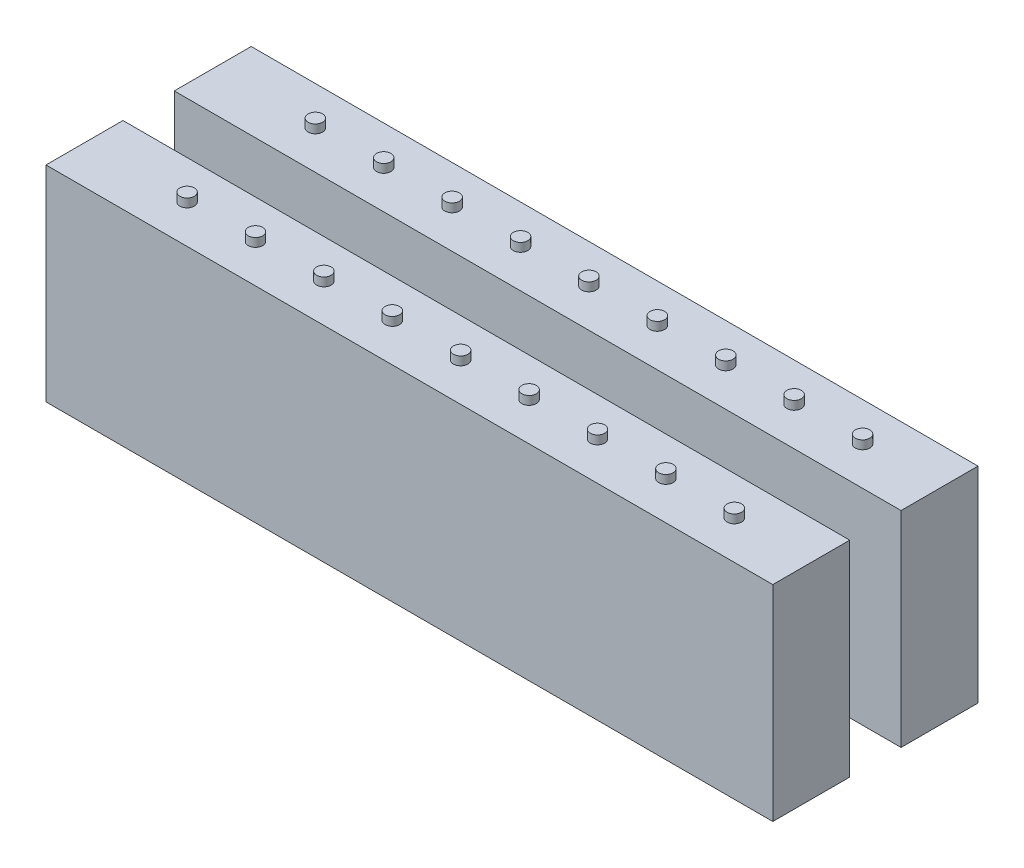
ISO-10303-21;
HEADER;
FILE_DESCRIPTION(('STEP AP214'),'2;1');
FILE_NAME('part.step','',(''),(''),'','','');
FILE_SCHEMA(('AUTOMOTIVE_DESIGN { 1 0 10303 214 1 1 1 1 }'));
ENDSEC;
DATA;
#1=APPLICATION_CONTEXT('core data for automotive mechanical design processes');
#2=APPLICATION_PROTOCOL_DEFINITION('international standard','automotive_design',2000,#1);
#3=PRODUCT_CONTEXT('',#1,'mechanical');
#4=PRODUCT('Part','Part','',(#3));
#5=PRODUCT_RELATED_PRODUCT_CATEGORY('part','',(#4));
#6=PRODUCT_DEFINITION_FORMATION('','',#4);
#7=PRODUCT_DEFINITION_CONTEXT('part definition',#1,'design');
#8=PRODUCT_DEFINITION('design','',#6,#7);
#9=PRODUCT_DEFINITION_SHAPE('','',#8);
#10=(LENGTH_UNIT() NAMED_UNIT(*) SI_UNIT(.MILLI.,.METRE.));
#11=(NAMED_UNIT(*) PLANE_ANGLE_UNIT() SI_UNIT($,.RADIAN.));
#12=(NAMED_UNIT(*) SI_UNIT($,.STERADIAN.) SOLID_ANGLE_UNIT());
#13=UNCERTAINTY_MEASURE_WITH_UNIT(LENGTH_MEASURE(1.E-05),#10,'distance_accuracy_value','');
#14=(GEOMETRIC_REPRESENTATION_CONTEXT(3) GLOBAL_UNCERTAINTY_ASSIGNED_CONTEXT((#13)) GLOBAL_UNIT_ASSIGNED_CONTEXT((#10,
#11,#12)) REPRESENTATION_CONTEXT('',''));
#15=CARTESIAN_POINT('',(0.,0.,0.));
#16=DIRECTION('',(0.,0.,1.));
#17=DIRECTION('',(1.,0.,0.));
#18=AXIS2_PLACEMENT_3D('',#15,#16,#17);
#19=CARTESIAN_POINT('',(-43.0162312083669,168.156845873752,207.38560548584));
#20=DIRECTION('',(1.,0.,0.));
#21=DIRECTION('',(0.,0.,-1.));
#22=AXIS2_PLACEMENT_3D('',#19,#20,#21);
#23=PLANE('',#22);
#24=DIRECTION('',(0.,0.,1.));
#25=VECTOR('',#24,1.);
#26=CARTESIAN_POINT('',(-43.0162312083669,165.616845873752,184.52560548584));
#27=LINE('',#26,#25);
#28=CARTESIAN_POINT('',(-43.0162312083669,165.616845873752,184.52560548584));
#29=VERTEX_POINT('',#28);
#30=CARTESIAN_POINT('',(-43.0162312083669,165.616845873752,207.38560548584));
#31=VERTEX_POINT('',#30);
#32=EDGE_CURVE('E89',#29,#31,#27,.T.);
#33=ORIENTED_EDGE('',*,*,#32,.F.);
#34=DIRECTION('',(0.,-1.,0.));
#35=VECTOR('',#34,1.);
#36=CARTESIAN_POINT('',(-43.0162312083669,168.156845873752,184.52560548584));
#37=LINE('',#36,#35);
#38=CARTESIAN_POINT('',(-43.0162312083669,104.656845873752,184.52560548584));
#39=VERTEX_POINT('',#38);
#40=EDGE_CURVE('E73',#29,#39,#37,.T.);
#41=ORIENTED_EDGE('',*,*,#40,.T.);
#42=DIRECTION('',(0.,0.,1.));
#43=VECTOR('',#42,1.);
#44=CARTESIAN_POINT('',(-43.0162312083669,104.656845873752,207.38560548584));
#45=LINE('',#44,#43);
#46=CARTESIAN_POINT('',(-43.0162312083669,104.656845873752,207.38560548584));
#47=VERTEX_POINT('',#46);
#48=EDGE_CURVE('E104',#39,#47,#45,.T.);
#49=ORIENTED_EDGE('',*,*,#48,.T.);
#50=DIRECTION('',(0.,-1.,0.));
#51=VECTOR('',#50,1.);
#52=CARTESIAN_POINT('',(-43.0162312083669,168.156845873752,207.38560548584));
#53=LINE('',#52,#51);
#54=EDGE_CURVE('E13',#31,#47,#53,.T.);
#55=ORIENTED_EDGE('',*,*,#54,.F.);
#56=EDGE_LOOP('',(#33,#41,#49,#55));
#57=FACE_BOUND('',#56,.T.);
#58=ADVANCED_FACE('F51',(#57),#23,.F.);
#59=CARTESIAN_POINT('',(-43.0162312083669,168.156845873752,207.38560548584));
#60=DIRECTION('',(0.,0.,-1.));
#61=DIRECTION('',(-1.,0.,0.));
#62=AXIS2_PLACEMENT_3D('',#59,#60,#61);
#63=PLANE('',#62);
#64=DIRECTION('',(1.,0.,0.));
#65=VECTOR('',#64,1.);
#66=CARTESIAN_POINT('',(-43.0162312083669,165.616845873752,207.38560548584));
#67=LINE('',#66,#65);
#68=CARTESIAN_POINT('',(172.883768791633,165.616845873752,207.38560548584));
#69=VERTEX_POINT('',#68);
#70=EDGE_CURVE('E92',#31,#69,#67,.T.);
#71=ORIENTED_EDGE('',*,*,#70,.F.);
#72=ORIENTED_EDGE('',*,*,#54,.T.);
#73=DIRECTION('',(1.,0.,0.));
#74=VECTOR('',#73,1.);
#75=CARTESIAN_POINT('',(-43.0162312083669,104.656845873752,207.38560548584));
#76=LINE('',#75,#74);
#77=CARTESIAN_POINT('',(172.883768791633,104.656845873752,207.38560548584));
#78=VERTEX_POINT('',#77);
#79=EDGE_CURVE('E107',#47,#78,#76,.T.);
#80=ORIENTED_EDGE('',*,*,#79,.T.);
#81=DIRECTION('',(0.,-1.,0.));
#82=VECTOR('',#81,1.);
#83=CARTESIAN_POINT('',(172.883768791633,168.156845873752,207.38560548584));
#84=LINE('',#83,#82);
#85=EDGE_CURVE('E58',#69,#78,#84,.T.);
#86=ORIENTED_EDGE('',*,*,#85,.F.);
#87=EDGE_LOOP('',(#71,#72,#80,#86));
#88=FACE_BOUND('',#87,.T.);
#89=ADVANCED_FACE('F99',(#88),#63,.F.);
#90=CARTESIAN_POINT('',(172.883768791633,168.156845873752,207.38560548584));
#91=DIRECTION('',(-1.,0.,0.));
#92=DIRECTION('',(0.,0.,1.));
#93=AXIS2_PLACEMENT_3D('',#90,#91,#92);
#94=PLANE('',#93);
#95=DIRECTION('',(0.,0.,-1.));
#96=VECTOR('',#95,1.);
#97=CARTESIAN_POINT('',(172.883768791633,165.616845873752,184.52560548584));
#98=LINE('',#97,#96);
#99=CARTESIAN_POINT('',(172.883768791633,165.616845873752,184.52560548584));
#100=VERTEX_POINT('',#99);
#101=EDGE_CURVE('E65',#69,#100,#98,.T.);
#102=ORIENTED_EDGE('',*,*,#101,.F.);
#103=ORIENTED_EDGE('',*,*,#85,.T.);
#104=DIRECTION('',(0.,0.,-1.));
#105=VECTOR('',#104,1.);
#106=CARTESIAN_POINT('',(172.883768791633,104.656845873752,207.38560548584));
#107=LINE('',#106,#105);
#108=CARTESIAN_POINT('',(172.883768791633,104.656845873752,184.52560548584));
#109=VERTEX_POINT('',#108);
#110=EDGE_CURVE('E109',#78,#109,#107,.T.);
#111=ORIENTED_EDGE('',*,*,#110,.T.);
#112=DIRECTION('',(0.,-1.,0.));
#113=VECTOR('',#112,1.);
#114=CARTESIAN_POINT('',(172.883768791633,168.156845873752,184.52560548584));
#115=LINE('',#114,#113);
#116=EDGE_CURVE('E127',#100,#109,#115,.T.);
#117=ORIENTED_EDGE('',*,*,#116,.F.);
#118=EDGE_LOOP('',(#102,#103,#111,#117));
#119=FACE_BOUND('',#118,.T.);
#120=ADVANCED_FACE('F129',(#119),#94,.F.);
#121=CARTESIAN_POINT('',(-43.0162312083669,168.156845873752,184.52560548584));
#122=DIRECTION('',(0.,0.,1.));
#123=DIRECTION('',(1.,0.,0.));
#124=AXIS2_PLACEMENT_3D('',#121,#122,#123);
#125=PLANE('',#124);
#126=DIRECTION('',(-1.,0.,0.));
#127=VECTOR('',#126,1.);
#128=CARTESIAN_POINT('',(-43.0162312083669,165.616845873752,184.52560548584));
#129=LINE('',#128,#127);
#130=EDGE_CURVE('E93',#100,#29,#129,.T.);
#131=ORIENTED_EDGE('',*,*,#130,.F.);
#132=ORIENTED_EDGE('',*,*,#116,.T.);
#133=DIRECTION('',(-1.,0.,0.));
#134=VECTOR('',#133,1.);
#135=CARTESIAN_POINT('',(-43.0162312083669,104.656845873752,184.52560548584));
#136=LINE('',#135,#134);
#137=EDGE_CURVE('E123',#109,#39,#136,.T.);
#138=ORIENTED_EDGE('',*,*,#137,.T.);
#139=ORIENTED_EDGE('',*,*,#40,.F.);
#140=EDGE_LOOP('',(#131,#132,#138,#139));
#141=FACE_BOUND('',#140,.T.);
#142=ADVANCED_FACE('F134',(#141),#125,.F.);
#143=CARTESIAN_POINT('',(-43.0162312083669,104.656845873752,207.38560548584));
#144=DIRECTION('',(0.,-1.,0.));
#145=DIRECTION('',(0.,0.,-1.));
#146=AXIS2_PLACEMENT_3D('',#143,#144,#145);
#147=PLANE('',#146);
#148=ORIENTED_EDGE('',*,*,#48,.F.);
#149=ORIENTED_EDGE('',*,*,#137,.F.);
#150=ORIENTED_EDGE('',*,*,#110,.F.);
#151=ORIENTED_EDGE('',*,*,#79,.F.);
#152=EDGE_LOOP('',(#148,#149,#150,#151));
#153=FACE_BOUND('',#152,.T.);
#154=ADVANCED_FACE('F132',(#153),#147,.T.);
#155=CARTESIAN_POINT('',(0.,165.616845873752,0.));
#156=DIRECTION('',(0.,1.,0.));
#157=DIRECTION('',(0.,0.,1.));
#158=AXIS2_PLACEMENT_3D('',#155,#156,#157);
#159=PLANE('',#158);
#160=CARTESIAN_POINT('',(150.023768791633,165.616845873752,195.95560548584));
#161=DIRECTION('',(0.,1.,0.));
#162=DIRECTION('',(0.,0.,1.));
#163=AXIS2_PLACEMENT_3D('',#160,#161,#162);
#164=CIRCLE('',#163,2.14999999999999);
#165=CARTESIAN_POINT('',(150.023768791633,165.616845873752,198.10560548584));
#166=VERTEX_POINT('',#165);
#167=EDGE_CURVE('E295',#166,#166,#164,.T.);
#168=ORIENTED_EDGE('',*,*,#167,.F.);
#169=EDGE_LOOP('',(#168));
#170=FACE_BOUND('',#169,.T.);
#171=CARTESIAN_POINT('',(129.703768791633,165.616845873752,195.95560548584));
#172=DIRECTION('',(0.,1.,0.));
#173=DIRECTION('',(0.,0.,1.));
#174=AXIS2_PLACEMENT_3D('',#171,#172,#173);
#175=CIRCLE('',#174,2.14999999999999);
#176=CARTESIAN_POINT('',(129.703768791633,165.616845873752,198.10560548584));
#177=VERTEX_POINT('',#176);
#178=EDGE_CURVE('E302',#177,#177,#175,.T.);
#179=ORIENTED_EDGE('',*,*,#178,.F.);
#180=EDGE_LOOP('',(#179));
#181=FACE_BOUND('',#180,.T.);
#182=CARTESIAN_POINT('',(109.383768791633,165.616845873752,195.95560548584));
#183=DIRECTION('',(0.,1.,0.));
#184=DIRECTION('',(0.,0.,1.));
#185=AXIS2_PLACEMENT_3D('',#182,#183,#184);
#186=CIRCLE('',#185,2.15000000000002);
#187=CARTESIAN_POINT('',(109.383768791633,165.616845873752,198.10560548584));
#188=VERTEX_POINT('',#187);
#189=EDGE_CURVE('E308',#188,#188,#186,.T.);
#190=ORIENTED_EDGE('',*,*,#189,.F.);
#191=EDGE_LOOP('',(#190));
#192=FACE_BOUND('',#191,.T.);
#193=CARTESIAN_POINT('',(89.0637687916331,165.616845873752,195.95560548584));
#194=DIRECTION('',(0.,1.,0.));
#195=DIRECTION('',(0.,0.,1.));
#196=AXIS2_PLACEMENT_3D('',#193,#194,#195);
#197=CIRCLE('',#196,2.15000000000002);
#198=CARTESIAN_POINT('',(89.0637687916331,165.616845873752,198.10560548584));
#199=VERTEX_POINT('',#198);
#200=EDGE_CURVE('E314',#199,#199,#197,.T.);
#201=ORIENTED_EDGE('',*,*,#200,.F.);
#202=EDGE_LOOP('',(#201));
#203=FACE_BOUND('',#202,.T.);
#204=CARTESIAN_POINT('',(68.7437687916331,165.616845873752,195.95560548584));
#205=DIRECTION('',(0.,1.,0.));
#206=DIRECTION('',(0.,0.,1.));
#207=AXIS2_PLACEMENT_3D('',#204,#205,#206);
#208=CIRCLE('',#207,2.15000000000002);
#209=CARTESIAN_POINT('',(68.7437687916331,165.616845873752,198.10560548584));
#210=VERTEX_POINT('',#209);
#211=EDGE_CURVE('E320',#210,#210,#208,.T.);
#212=ORIENTED_EDGE('',*,*,#211,.F.);
#213=EDGE_LOOP('',(#212));
#214=FACE_BOUND('',#213,.T.);
#215=CARTESIAN_POINT('',(48.4237687916331,165.616845873752,195.95560548584));
#216=DIRECTION('',(0.,1.,0.));
#217=DIRECTION('',(0.,0.,1.));
#218=AXIS2_PLACEMENT_3D('',#215,#216,#217);
#219=CIRCLE('',#218,2.15000000000002);
#220=CARTESIAN_POINT('',(48.4237687916331,165.616845873752,198.10560548584));
#221=VERTEX_POINT('',#220);
#222=EDGE_CURVE('E326',#221,#221,#219,.T.);
#223=ORIENTED_EDGE('',*,*,#222,.F.);
#224=EDGE_LOOP('',(#223));
#225=FACE_BOUND('',#224,.T.);
#226=CARTESIAN_POINT('',(28.1037687916331,165.616845873752,195.95560548584));
#227=DIRECTION('',(0.,1.,0.));
#228=DIRECTION('',(0.,0.,1.));
#229=AXIS2_PLACEMENT_3D('',#226,#227,#228);
#230=CIRCLE('',#229,2.15000000000001);
#231=CARTESIAN_POINT('',(28.1037687916331,165.616845873752,198.10560548584));
#232=VERTEX_POINT('',#231);
#233=EDGE_CURVE('E332',#232,#232,#230,.T.);
#234=ORIENTED_EDGE('',*,*,#233,.F.);
#235=EDGE_LOOP('',(#234));
#236=FACE_BOUND('',#235,.T.);
#237=CARTESIAN_POINT('',(7.78376879163307,165.616845873752,195.95560548584));
#238=DIRECTION('',(0.,1.,0.));
#239=DIRECTION('',(0.,0.,1.));
#240=AXIS2_PLACEMENT_3D('',#237,#238,#239);
#241=CIRCLE('',#240,2.15000000000001);
#242=CARTESIAN_POINT('',(7.78376879163307,165.616845873752,198.10560548584));
#243=VERTEX_POINT('',#242);
#244=EDGE_CURVE('E338',#243,#243,#241,.T.);
#245=ORIENTED_EDGE('',*,*,#244,.F.);
#246=EDGE_LOOP('',(#245));
#247=FACE_BOUND('',#246,.T.);
#248=CARTESIAN_POINT('',(-12.5362312083669,165.616845873752,195.95560548584));
#249=DIRECTION('',(0.,1.,0.));
#250=DIRECTION('',(0.,0.,1.));
#251=AXIS2_PLACEMENT_3D('',#248,#249,#250);
#252=CIRCLE('',#251,2.15000000000001);
#253=CARTESIAN_POINT('',(-12.5362312083669,165.616845873752,198.10560548584));
#254=VERTEX_POINT('',#253);
#255=EDGE_CURVE('E95',#254,#254,#252,.T.);
#256=ORIENTED_EDGE('',*,*,#255,.F.);
#257=EDGE_LOOP('',(#256));
#258=FACE_BOUND('',#257,.T.);
#259=ORIENTED_EDGE('',*,*,#32,.T.);
#260=ORIENTED_EDGE('',*,*,#70,.T.);
#261=ORIENTED_EDGE('',*,*,#101,.T.);
#262=ORIENTED_EDGE('',*,*,#130,.T.);
#263=EDGE_LOOP('',(#259,#260,#261,#262));
#264=FACE_BOUND('',#263,.T.);
#265=ADVANCED_FACE('F91',(#170,#181,#192,#203,#214,#225,#236,#247,#258,#264),#159,.T.);
#266=CARTESIAN_POINT('',(-12.5362312083669,165.616845873752,195.95560548584));
#267=DIRECTION('',(0.,1.,0.));
#268=DIRECTION('',(0.,0.,1.));
#269=AXIS2_PLACEMENT_3D('',#266,#267,#268);
#270=CYLINDRICAL_SURFACE('',#269,2.15000000000001);
#271=ORIENTED_EDGE('',*,*,#255,.T.);
#272=EDGE_LOOP('',(#271));
#273=FACE_BOUND('',#272,.T.);
#274=CARTESIAN_POINT('',(-12.5362312083669,168.156845873752,195.95560548584));
#275=DIRECTION('',(0.,1.,0.));
#276=DIRECTION('',(0.,0.,1.));
#277=AXIS2_PLACEMENT_3D('',#274,#275,#276);
#278=CIRCLE('',#277,2.15000000000001);
#279=CARTESIAN_POINT('',(-12.5362312083669,168.156845873752,198.10560548584));
#280=VERTEX_POINT('',#279);
#281=EDGE_CURVE('E341',#280,#280,#278,.T.);
#282=ORIENTED_EDGE('',*,*,#281,.F.);
#283=EDGE_LOOP('',(#282));
#284=FACE_BOUND('',#283,.T.);
#285=ADVANCED_FACE('F256',(#273,#284),#270,.T.);
#286=CARTESIAN_POINT('',(7.78376879163307,165.616845873752,195.95560548584));
#287=DIRECTION('',(0.,1.,0.));
#288=DIRECTION('',(0.,0.,1.));
#289=AXIS2_PLACEMENT_3D('',#286,#287,#288);
#290=CYLINDRICAL_SURFACE('',#289,2.15000000000001);
#291=ORIENTED_EDGE('',*,*,#244,.T.);
#292=EDGE_LOOP('',(#291));
#293=FACE_BOUND('',#292,.T.);
#294=CARTESIAN_POINT('',(7.78376879163307,168.156845873752,195.95560548584));
#295=DIRECTION('',(0.,1.,0.));
#296=DIRECTION('',(0.,0.,1.));
#297=AXIS2_PLACEMENT_3D('',#294,#295,#296);
#298=CIRCLE('',#297,2.15000000000001);
#299=CARTESIAN_POINT('',(7.78376879163307,168.156845873752,198.10560548584));
#300=VERTEX_POINT('',#299);
#301=EDGE_CURVE('E335',#300,#300,#298,.T.);
#302=ORIENTED_EDGE('',*,*,#301,.F.);
#303=EDGE_LOOP('',(#302));
#304=FACE_BOUND('',#303,.T.);
#305=ADVANCED_FACE('F260',(#293,#304),#290,.T.);
#306=CARTESIAN_POINT('',(28.1037687916331,165.616845873752,195.95560548584));
#307=DIRECTION('',(0.,1.,0.));
#308=DIRECTION('',(0.,0.,1.));
#309=AXIS2_PLACEMENT_3D('',#306,#307,#308);
#310=CYLINDRICAL_SURFACE('',#309,2.15000000000001);
#311=ORIENTED_EDGE('',*,*,#233,.T.);
#312=EDGE_LOOP('',(#311));
#313=FACE_BOUND('',#312,.T.);
#314=CARTESIAN_POINT('',(28.1037687916331,168.156845873752,195.95560548584));
#315=DIRECTION('',(0.,1.,0.));
#316=DIRECTION('',(0.,0.,1.));
#317=AXIS2_PLACEMENT_3D('',#314,#315,#316);
#318=CIRCLE('',#317,2.15000000000001);
#319=CARTESIAN_POINT('',(28.1037687916331,168.156845873752,198.10560548584));
#320=VERTEX_POINT('',#319);
#321=EDGE_CURVE('E329',#320,#320,#318,.T.);
#322=ORIENTED_EDGE('',*,*,#321,.F.);
#323=EDGE_LOOP('',(#322));
#324=FACE_BOUND('',#323,.T.);
#325=ADVANCED_FACE('F264',(#313,#324),#310,.T.);
#326=CARTESIAN_POINT('',(48.4237687916331,165.616845873752,195.95560548584));
#327=DIRECTION('',(0.,1.,0.));
#328=DIRECTION('',(0.,0.,1.));
#329=AXIS2_PLACEMENT_3D('',#326,#327,#328);
#330=CYLINDRICAL_SURFACE('',#329,2.15000000000002);
#331=ORIENTED_EDGE('',*,*,#222,.T.);
#332=EDGE_LOOP('',(#331));
#333=FACE_BOUND('',#332,.T.);
#334=CARTESIAN_POINT('',(48.4237687916331,168.156845873752,195.95560548584));
#335=DIRECTION('',(0.,1.,0.));
#336=DIRECTION('',(0.,0.,1.));
#337=AXIS2_PLACEMENT_3D('',#334,#335,#336);
#338=CIRCLE('',#337,2.15000000000002);
#339=CARTESIAN_POINT('',(48.4237687916331,168.156845873752,198.10560548584));
#340=VERTEX_POINT('',#339);
#341=EDGE_CURVE('E323',#340,#340,#338,.T.);
#342=ORIENTED_EDGE('',*,*,#341,.F.);
#343=EDGE_LOOP('',(#342));
#344=FACE_BOUND('',#343,.T.);
#345=ADVANCED_FACE('F268',(#333,#344),#330,.T.);
#346=CARTESIAN_POINT('',(68.7437687916331,165.616845873752,195.95560548584));
#347=DIRECTION('',(0.,1.,0.));
#348=DIRECTION('',(0.,0.,1.));
#349=AXIS2_PLACEMENT_3D('',#346,#347,#348);
#350=CYLINDRICAL_SURFACE('',#349,2.15000000000002);
#351=ORIENTED_EDGE('',*,*,#211,.T.);
#352=EDGE_LOOP('',(#351));
#353=FACE_BOUND('',#352,.T.);
#354=CARTESIAN_POINT('',(68.7437687916331,168.156845873752,195.95560548584));
#355=DIRECTION('',(0.,1.,0.));
#356=DIRECTION('',(0.,0.,1.));
#357=AXIS2_PLACEMENT_3D('',#354,#355,#356);
#358=CIRCLE('',#357,2.15000000000002);
#359=CARTESIAN_POINT('',(68.7437687916331,168.156845873752,198.10560548584));
#360=VERTEX_POINT('',#359);
#361=EDGE_CURVE('E317',#360,#360,#358,.T.);
#362=ORIENTED_EDGE('',*,*,#361,.F.);
#363=EDGE_LOOP('',(#362));
#364=FACE_BOUND('',#363,.T.);
#365=ADVANCED_FACE('F272',(#353,#364),#350,.T.);
#366=CARTESIAN_POINT('',(89.0637687916331,165.616845873752,195.95560548584));
#367=DIRECTION('',(0.,1.,0.));
#368=DIRECTION('',(0.,0.,1.));
#369=AXIS2_PLACEMENT_3D('',#366,#367,#368);
#370=CYLINDRICAL_SURFACE('',#369,2.15000000000002);
#371=ORIENTED_EDGE('',*,*,#200,.T.);
#372=EDGE_LOOP('',(#371));
#373=FACE_BOUND('',#372,.T.);
#374=CARTESIAN_POINT('',(89.0637687916331,168.156845873752,195.95560548584));
#375=DIRECTION('',(0.,1.,0.));
#376=DIRECTION('',(0.,0.,1.));
#377=AXIS2_PLACEMENT_3D('',#374,#375,#376);
#378=CIRCLE('',#377,2.15000000000002);
#379=CARTESIAN_POINT('',(89.0637687916331,168.156845873752,198.10560548584));
#380=VERTEX_POINT('',#379);
#381=EDGE_CURVE('E311',#380,#380,#378,.T.);
#382=ORIENTED_EDGE('',*,*,#381,.F.);
#383=EDGE_LOOP('',(#382));
#384=FACE_BOUND('',#383,.T.);
#385=ADVANCED_FACE('F276',(#373,#384),#370,.T.);
#386=CARTESIAN_POINT('',(109.383768791633,165.616845873752,195.95560548584));
#387=DIRECTION('',(0.,1.,0.));
#388=DIRECTION('',(0.,0.,1.));
#389=AXIS2_PLACEMENT_3D('',#386,#387,#388);
#390=CYLINDRICAL_SURFACE('',#389,2.15000000000002);
#391=ORIENTED_EDGE('',*,*,#189,.T.);
#392=EDGE_LOOP('',(#391));
#393=FACE_BOUND('',#392,.T.);
#394=CARTESIAN_POINT('',(109.383768791633,168.156845873752,195.95560548584));
#395=DIRECTION('',(0.,1.,0.));
#396=DIRECTION('',(0.,0.,1.));
#397=AXIS2_PLACEMENT_3D('',#394,#395,#396);
#398=CIRCLE('',#397,2.15000000000002);
#399=CARTESIAN_POINT('',(109.383768791633,168.156845873752,198.10560548584));
#400=VERTEX_POINT('',#399);
#401=EDGE_CURVE('E305',#400,#400,#398,.T.);
#402=ORIENTED_EDGE('',*,*,#401,.F.);
#403=EDGE_LOOP('',(#402));
#404=FACE_BOUND('',#403,.T.);
#405=ADVANCED_FACE('F280',(#393,#404),#390,.T.);
#406=CARTESIAN_POINT('',(129.703768791633,165.616845873752,195.95560548584));
#407=DIRECTION('',(0.,1.,0.));
#408=DIRECTION('',(0.,0.,1.));
#409=AXIS2_PLACEMENT_3D('',#406,#407,#408);
#410=CYLINDRICAL_SURFACE('',#409,2.14999999999999);
#411=ORIENTED_EDGE('',*,*,#178,.T.);
#412=EDGE_LOOP('',(#411));
#413=FACE_BOUND('',#412,.T.);
#414=CARTESIAN_POINT('',(129.703768791633,168.156845873752,195.95560548584));
#415=DIRECTION('',(0.,1.,0.));
#416=DIRECTION('',(0.,0.,1.));
#417=AXIS2_PLACEMENT_3D('',#414,#415,#416);
#418=CIRCLE('',#417,2.14999999999999);
#419=CARTESIAN_POINT('',(129.703768791633,168.156845873752,198.10560548584));
#420=VERTEX_POINT('',#419);
#421=EDGE_CURVE('E299',#420,#420,#418,.T.);
#422=ORIENTED_EDGE('',*,*,#421,.F.);
#423=EDGE_LOOP('',(#422));
#424=FACE_BOUND('',#423,.T.);
#425=ADVANCED_FACE('F284',(#413,#424),#410,.T.);
#426=CARTESIAN_POINT('',(150.023768791633,165.616845873752,195.95560548584));
#427=DIRECTION('',(0.,1.,0.));
#428=DIRECTION('',(0.,0.,1.));
#429=AXIS2_PLACEMENT_3D('',#426,#427,#428);
#430=CYLINDRICAL_SURFACE('',#429,2.14999999999999);
#431=ORIENTED_EDGE('',*,*,#167,.T.);
#432=EDGE_LOOP('',(#431));
#433=FACE_BOUND('',#432,.T.);
#434=CARTESIAN_POINT('',(150.023768791633,168.156845873752,195.95560548584));
#435=DIRECTION('',(0.,1.,0.));
#436=DIRECTION('',(0.,0.,1.));
#437=AXIS2_PLACEMENT_3D('',#434,#435,#436);
#438=CIRCLE('',#437,2.14999999999999);
#439=CARTESIAN_POINT('',(150.023768791633,168.156845873752,198.10560548584));
#440=VERTEX_POINT('',#439);
#441=EDGE_CURVE('E297',#440,#440,#438,.T.);
#442=ORIENTED_EDGE('',*,*,#441,.F.);
#443=EDGE_LOOP('',(#442));
#444=FACE_BOUND('',#443,.T.);
#445=ADVANCED_FACE('F234',(#433,#444),#430,.T.);
#446=CARTESIAN_POINT('',(-43.0162312083669,168.156845873752,207.38560548584));
#447=DIRECTION('',(0.,-1.,0.));
#448=DIRECTION('',(0.,0.,-1.));
#449=AXIS2_PLACEMENT_3D('',#446,#447,#448);
#450=PLANE('',#449);
#451=ORIENTED_EDGE('',*,*,#421,.T.);
#452=EDGE_LOOP('',(#451));
#453=FACE_BOUND('',#452,.T.);
#454=ADVANCED_FACE('F225',(#453),#450,.F.);
#455=ORIENTED_EDGE('',*,*,#401,.T.);
#456=EDGE_LOOP('',(#455));
#457=FACE_BOUND('',#456,.T.);
#458=ADVANCED_FACE('F216',(#457),#450,.F.);
#459=ORIENTED_EDGE('',*,*,#381,.T.);
#460=EDGE_LOOP('',(#459));
#461=FACE_BOUND('',#460,.T.);
#462=ADVANCED_FACE('F207',(#461),#450,.F.);
#463=ORIENTED_EDGE('',*,*,#361,.T.);
#464=EDGE_LOOP('',(#463));
#465=FACE_BOUND('',#464,.T.);
#466=ADVANCED_FACE('F198',(#465),#450,.F.);
#467=ORIENTED_EDGE('',*,*,#341,.T.);
#468=EDGE_LOOP('',(#467));
#469=FACE_BOUND('',#468,.T.);
#470=ADVANCED_FACE('F189',(#469),#450,.F.);
#471=ORIENTED_EDGE('',*,*,#321,.T.);
#472=EDGE_LOOP('',(#471));
#473=FACE_BOUND('',#472,.T.);
#474=ADVANCED_FACE('F180',(#473),#450,.F.);
#475=ORIENTED_EDGE('',*,*,#301,.T.);
#476=EDGE_LOOP('',(#475));
#477=FACE_BOUND('',#476,.T.);
#478=ADVANCED_FACE('F169',(#477),#450,.F.);
#479=ORIENTED_EDGE('',*,*,#281,.T.);
#480=EDGE_LOOP('',(#479));
#481=FACE_BOUND('',#480,.T.);
#482=ADVANCED_FACE('F164',(#481),#450,.F.);
#483=ORIENTED_EDGE('',*,*,#441,.T.);
#484=EDGE_LOOP('',(#483));
#485=FACE_BOUND('',#484,.T.);
#486=ADVANCED_FACE('F168',(#485),#450,.F.);
#487=CLOSED_SHELL('',(#58,#89,#120,#142,#154,#265,#285,#305,#325,#345,#365,#385,#405,#425,#445,
#454,#458,#462,#466,#470,#474,#478,#482,#486));
#488=MANIFOLD_SOLID_BREP('B2',#487);
#489=CARTESIAN_POINT('',(-43.0162312083669,168.156845873752,146.42560548584));
#490=DIRECTION('',(-1.,0.,0.));
#491=DIRECTION('',(0.,0.,1.));
#492=AXIS2_PLACEMENT_3D('',#489,#490,#491);
#493=PLANE('',#492);
#494=DIRECTION('',(0.,-1.,0.));
#495=VECTOR('',#494,1.);
#496=CARTESIAN_POINT('',(-43.0162312083669,168.156845873752,169.28560548584));
#497=LINE('',#496,#495);
#498=CARTESIAN_POINT('',(-43.0162312083669,165.616845873752,169.28560548584));
#499=VERTEX_POINT('',#498);
#500=CARTESIAN_POINT('',(-43.0162312083669,104.656845873752,169.28560548584));
#501=VERTEX_POINT('',#500);
#502=EDGE_CURVE('E499',#499,#501,#497,.T.);
#503=ORIENTED_EDGE('',*,*,#502,.F.);
#504=DIRECTION('',(0.,0.,1.));
#505=VECTOR('',#504,1.);
#506=CARTESIAN_POINT('',(-43.0162312083669,165.616845873752,146.42560548584));
#507=LINE('',#506,#505);
#508=CARTESIAN_POINT('',(-43.0162312083669,165.616845873752,146.42560548584));
#509=VERTEX_POINT('',#508);
#510=EDGE_CURVE('E460',#509,#499,#507,.T.);
#511=ORIENTED_EDGE('',*,*,#510,.F.);
#512=DIRECTION('',(0.,-1.,0.));
#513=VECTOR('',#512,1.);
#514=CARTESIAN_POINT('',(-43.0162312083669,168.156845873752,146.42560548584));
#515=LINE('',#514,#513);
#516=CARTESIAN_POINT('',(-43.0162312083669,104.656845873752,146.42560548584));
#517=VERTEX_POINT('',#516);
#518=EDGE_CURVE('E495',#509,#517,#515,.T.);
#519=ORIENTED_EDGE('',*,*,#518,.T.);
#520=DIRECTION('',(0.,0.,1.));
#521=VECTOR('',#520,1.);
#522=CARTESIAN_POINT('',(-43.0162312083669,104.656845873752,146.42560548584));
#523=LINE('',#522,#521);
#524=EDGE_CURVE('E448',#517,#501,#523,.T.);
#525=ORIENTED_EDGE('',*,*,#524,.T.);
#526=EDGE_LOOP('',(#503,#511,#519,#525));
#527=FACE_BOUND('',#526,.T.);
#528=ADVANCED_FACE('F445',(#527),#493,.T.);
#529=CARTESIAN_POINT('',(172.883768791633,104.656845873752,146.42560548584));
#530=DIRECTION('',(1.,0.,0.));
#531=DIRECTION('',(0.,0.,-1.));
#532=AXIS2_PLACEMENT_3D('',#529,#530,#531);
#533=PLANE('',#532);
#534=DIRECTION('',(0.,1.,0.));
#535=VECTOR('',#534,1.);
#536=CARTESIAN_POINT('',(172.883768791633,104.656845873752,146.42560548584));
#537=LINE('',#536,#535);
#538=CARTESIAN_POINT('',(172.883768791633,104.656845873752,146.42560548584));
#539=VERTEX_POINT('',#538);
#540=CARTESIAN_POINT('',(172.883768791633,165.616845873752,146.42560548584));
#541=VERTEX_POINT('',#540);
#542=EDGE_CURVE('E507',#539,#541,#537,.T.);
#543=ORIENTED_EDGE('',*,*,#542,.T.);
#544=DIRECTION('',(0.,0.,-1.));
#545=VECTOR('',#544,1.);
#546=CARTESIAN_POINT('',(172.883768791633,165.616845873752,146.42560548584));
#547=LINE('',#546,#545);
#548=CARTESIAN_POINT('',(172.883768791633,165.616845873752,169.28560548584));
#549=VERTEX_POINT('',#548);
#550=EDGE_CURVE('E492',#549,#541,#547,.T.);
#551=ORIENTED_EDGE('',*,*,#550,.F.);
#552=DIRECTION('',(0.,1.,0.));
#553=VECTOR('',#552,1.);
#554=CARTESIAN_POINT('',(172.883768791633,104.656845873752,169.28560548584));
#555=LINE('',#554,#553);
#556=CARTESIAN_POINT('',(172.883768791633,104.656845873752,169.28560548584));
#557=VERTEX_POINT('',#556);
#558=EDGE_CURVE('E488',#557,#549,#555,.T.);
#559=ORIENTED_EDGE('',*,*,#558,.F.);
#560=DIRECTION('',(0.,0.,1.));
#561=VECTOR('',#560,1.);
#562=CARTESIAN_POINT('',(172.883768791633,104.656845873752,146.42560548584));
#563=LINE('',#562,#561);
#564=EDGE_CURVE('E49',#539,#557,#563,.T.);
#565=ORIENTED_EDGE('',*,*,#564,.F.);
#566=EDGE_LOOP('',(#543,#551,#559,#565));
#567=FACE_BOUND('',#566,.T.);
#568=ADVANCED_FACE('F489',(#567),#533,.T.);
#569=CARTESIAN_POINT('',(0.,0.,146.42560548584));
#570=DIRECTION('',(0.,0.,1.));
#571=DIRECTION('',(1.,0.,0.));
#572=AXIS2_PLACEMENT_3D('',#569,#570,#571);
#573=PLANE('',#572);
#574=DIRECTION('',(-1.,0.,0.));
#575=VECTOR('',#574,1.);
#576=CARTESIAN_POINT('',(-43.0162312083669,165.616845873752,146.42560548584));
#577=LINE('',#576,#575);
#578=EDGE_CURVE('E504',#541,#509,#577,.T.);
#579=ORIENTED_EDGE('',*,*,#578,.F.);
#580=ORIENTED_EDGE('',*,*,#542,.F.);
#581=DIRECTION('',(1.,0.,0.));
#582=VECTOR('',#581,1.);
#583=CARTESIAN_POINT('',(-43.0162312083669,104.656845873752,146.42560548584));
#584=LINE('',#583,#582);
#585=EDGE_CURVE('E485',#517,#539,#584,.T.);
#586=ORIENTED_EDGE('',*,*,#585,.F.);
#587=ORIENTED_EDGE('',*,*,#518,.F.);
#588=EDGE_LOOP('',(#579,#580,#586,#587));
#589=FACE_BOUND('',#588,.T.);
#590=ADVANCED_FACE('F646',(#589),#573,.F.);
#591=CARTESIAN_POINT('',(0.,0.,169.28560548584));
#592=DIRECTION('',(0.,0.,1.));
#593=DIRECTION('',(1.,0.,0.));
#594=AXIS2_PLACEMENT_3D('',#591,#592,#593);
#595=PLANE('',#594);
#596=ORIENTED_EDGE('',*,*,#558,.T.);
#597=DIRECTION('',(1.,0.,0.));
#598=VECTOR('',#597,1.);
#599=CARTESIAN_POINT('',(-43.0162312083669,165.616845873752,169.28560548584));
#600=LINE('',#599,#598);
#601=EDGE_CURVE('E518',#499,#549,#600,.T.);
#602=ORIENTED_EDGE('',*,*,#601,.F.);
#603=ORIENTED_EDGE('',*,*,#502,.T.);
#604=DIRECTION('',(1.,0.,0.));
#605=VECTOR('',#604,1.);
#606=CARTESIAN_POINT('',(-43.0162312083669,104.656845873752,169.28560548584));
#607=LINE('',#606,#605);
#608=EDGE_CURVE('E483',#501,#557,#607,.T.);
#609=ORIENTED_EDGE('',*,*,#608,.T.);
#610=EDGE_LOOP('',(#596,#602,#603,#609));
#611=FACE_BOUND('',#610,.T.);
#612=ADVANCED_FACE('F497',(#611),#595,.T.);
#613=CARTESIAN_POINT('',(-43.0162312083669,104.656845873752,146.42560548584));
#614=DIRECTION('',(0.,-1.,0.));
#615=DIRECTION('',(0.,0.,-1.));
#616=AXIS2_PLACEMENT_3D('',#613,#614,#615);
#617=PLANE('',#616);
#618=ORIENTED_EDGE('',*,*,#608,.F.);
#619=ORIENTED_EDGE('',*,*,#524,.F.);
#620=ORIENTED_EDGE('',*,*,#585,.T.);
#621=ORIENTED_EDGE('',*,*,#564,.T.);
#622=EDGE_LOOP('',(#618,#619,#620,#621));
#623=FACE_BOUND('',#622,.T.);
#624=ADVANCED_FACE('F480',(#623),#617,.T.);
#625=CARTESIAN_POINT('',(0.,165.616845873752,0.));
#626=DIRECTION('',(0.,1.,0.));
#627=DIRECTION('',(0.,0.,1.));
#628=AXIS2_PLACEMENT_3D('',#625,#626,#627);
#629=PLANE('',#628);
#630=CARTESIAN_POINT('',(150.023768791633,165.616845873752,157.85560548584));
#631=DIRECTION('',(0.,1.,0.));
#632=DIRECTION('',(0.,0.,1.));
#633=AXIS2_PLACEMENT_3D('',#630,#631,#632);
#634=CIRCLE('',#633,2.15000000000002);
#635=CARTESIAN_POINT('',(150.023768791633,165.616845873752,160.00560548584));
#636=VERTEX_POINT('',#635);
#637=EDGE_CURVE('E584',#636,#636,#634,.T.);
#638=ORIENTED_EDGE('',*,*,#637,.F.);
#639=EDGE_LOOP('',(#638));
#640=FACE_BOUND('',#639,.T.);
#641=CARTESIAN_POINT('',(129.703768791633,165.616845873752,157.85560548584));
#642=DIRECTION('',(0.,1.,0.));
#643=DIRECTION('',(0.,0.,1.));
#644=AXIS2_PLACEMENT_3D('',#641,#642,#643);
#645=CIRCLE('',#644,2.15000000000002);
#646=CARTESIAN_POINT('',(129.703768791633,165.616845873752,160.00560548584));
#647=VERTEX_POINT('',#646);
#648=EDGE_CURVE('E576',#647,#647,#645,.T.);
#649=ORIENTED_EDGE('',*,*,#648,.F.);
#650=EDGE_LOOP('',(#649));
#651=FACE_BOUND('',#650,.T.);
#652=CARTESIAN_POINT('',(109.383768791633,165.616845873752,157.85560548584));
#653=DIRECTION('',(0.,1.,0.));
#654=DIRECTION('',(0.,0.,1.));
#655=AXIS2_PLACEMENT_3D('',#652,#653,#654);
#656=CIRCLE('',#655,2.15000000000002);
#657=CARTESIAN_POINT('',(109.383768791633,165.616845873752,160.00560548584));
#658=VERTEX_POINT('',#657);
#659=EDGE_CURVE('E568',#658,#658,#656,.T.);
#660=ORIENTED_EDGE('',*,*,#659,.F.);
#661=EDGE_LOOP('',(#660));
#662=FACE_BOUND('',#661,.T.);
#663=CARTESIAN_POINT('',(89.0637687916331,165.616845873752,157.85560548584));
#664=DIRECTION('',(0.,1.,0.));
#665=DIRECTION('',(0.,0.,1.));
#666=AXIS2_PLACEMENT_3D('',#663,#664,#665);
#667=CIRCLE('',#666,2.15000000000002);
#668=CARTESIAN_POINT('',(89.0637687916331,165.616845873752,160.00560548584));
#669=VERTEX_POINT('',#668);
#670=EDGE_CURVE('E560',#669,#669,#667,.T.);
#671=ORIENTED_EDGE('',*,*,#670,.F.);
#672=EDGE_LOOP('',(#671));
#673=FACE_BOUND('',#672,.T.);
#674=CARTESIAN_POINT('',(68.7437687916331,165.616845873752,157.85560548584));
#675=DIRECTION('',(0.,1.,0.));
#676=DIRECTION('',(0.,0.,1.));
#677=AXIS2_PLACEMENT_3D('',#674,#675,#676);
#678=CIRCLE('',#677,2.15000000000002);
#679=CARTESIAN_POINT('',(68.7437687916331,165.616845873752,160.00560548584));
#680=VERTEX_POINT('',#679);
#681=EDGE_CURVE('E552',#680,#680,#678,.T.);
#682=ORIENTED_EDGE('',*,*,#681,.F.);
#683=EDGE_LOOP('',(#682));
#684=FACE_BOUND('',#683,.T.);
#685=CARTESIAN_POINT('',(48.4237687916331,165.616845873752,157.85560548584));
#686=DIRECTION('',(0.,1.,0.));
#687=DIRECTION('',(0.,0.,1.));
#688=AXIS2_PLACEMENT_3D('',#685,#686,#687);
#689=CIRCLE('',#688,2.15000000000002);
#690=CARTESIAN_POINT('',(48.4237687916331,165.616845873752,160.00560548584));
#691=VERTEX_POINT('',#690);
#692=EDGE_CURVE('E544',#691,#691,#689,.T.);
#693=ORIENTED_EDGE('',*,*,#692,.F.);
#694=EDGE_LOOP('',(#693));
#695=FACE_BOUND('',#694,.T.);
#696=CARTESIAN_POINT('',(28.1037687916331,165.616845873752,157.85560548584));
#697=DIRECTION('',(0.,1.,0.));
#698=DIRECTION('',(0.,0.,1.));
#699=AXIS2_PLACEMENT_3D('',#696,#697,#698);
#700=CIRCLE('',#699,2.15000000000002);
#701=CARTESIAN_POINT('',(28.1037687916331,165.616845873752,160.00560548584));
#702=VERTEX_POINT('',#701);
#703=EDGE_CURVE('E536',#702,#702,#700,.T.);
#704=ORIENTED_EDGE('',*,*,#703,.F.);
#705=EDGE_LOOP('',(#704));
#706=FACE_BOUND('',#705,.T.);
#707=CARTESIAN_POINT('',(7.78376879163307,165.616845873752,157.85560548584));
#708=DIRECTION('',(0.,1.,0.));
#709=DIRECTION('',(0.,0.,1.));
#710=AXIS2_PLACEMENT_3D('',#707,#708,#709);
#711=CIRCLE('',#710,2.15000000000002);
#712=CARTESIAN_POINT('',(7.78376879163307,165.616845873752,160.00560548584));
#713=VERTEX_POINT('',#712);
#714=EDGE_CURVE('E528',#713,#713,#711,.T.);
#715=ORIENTED_EDGE('',*,*,#714,.F.);
#716=EDGE_LOOP('',(#715));
#717=FACE_BOUND('',#716,.T.);
#718=CARTESIAN_POINT('',(-12.5362312083669,165.616845873752,157.85560548584));
#719=DIRECTION('',(0.,1.,0.));
#720=DIRECTION('',(0.,0.,1.));
#721=AXIS2_PLACEMENT_3D('',#718,#719,#720);
#722=CIRCLE('',#721,2.15000000000002);
#723=CARTESIAN_POINT('',(-12.5362312083669,165.616845873752,160.00560548584));
#724=VERTEX_POINT('',#723);
#725=EDGE_CURVE('E523',#724,#724,#722,.T.);
#726=ORIENTED_EDGE('',*,*,#725,.F.);
#727=EDGE_LOOP('',(#726));
#728=FACE_BOUND('',#727,.T.);
#729=ORIENTED_EDGE('',*,*,#510,.T.);
#730=ORIENTED_EDGE('',*,*,#601,.T.);
#731=ORIENTED_EDGE('',*,*,#550,.T.);
#732=ORIENTED_EDGE('',*,*,#578,.T.);
#733=EDGE_LOOP('',(#729,#730,#731,#732));
#734=FACE_BOUND('',#733,.T.);
#735=ADVANCED_FACE('F599',(#640,#651,#662,#673,#684,#695,#706,#717,#728,#734),#629,.T.);
#736=CARTESIAN_POINT('',(-12.5362312083669,165.616845873752,157.85560548584));
#737=DIRECTION('',(0.,1.,0.));
#738=DIRECTION('',(0.,0.,1.));
#739=AXIS2_PLACEMENT_3D('',#736,#737,#738);
#740=CYLINDRICAL_SURFACE('',#739,2.15000000000002);
#741=ORIENTED_EDGE('',*,*,#725,.T.);
#742=EDGE_LOOP('',(#741));
#743=FACE_BOUND('',#742,.T.);
#744=CARTESIAN_POINT('',(-12.5362312083669,168.156845873752,157.85560548584));
#745=DIRECTION('',(0.,1.,0.));
#746=DIRECTION('',(0.,0.,1.));
#747=AXIS2_PLACEMENT_3D('',#744,#745,#746);
#748=CIRCLE('',#747,2.15000000000002);
#749=CARTESIAN_POINT('',(-12.5362312083669,168.156845873752,160.00560548584));
#750=VERTEX_POINT('',#749);
#751=EDGE_CURVE('E524',#750,#750,#748,.T.);
#752=ORIENTED_EDGE('',*,*,#751,.F.);
#753=EDGE_LOOP('',(#752));
#754=FACE_BOUND('',#753,.T.);
#755=ADVANCED_FACE('F602',(#743,#754),#740,.T.);
#756=CARTESIAN_POINT('',(7.78376879163307,165.616845873752,157.85560548584));
#757=DIRECTION('',(0.,1.,0.));
#758=DIRECTION('',(0.,0.,1.));
#759=AXIS2_PLACEMENT_3D('',#756,#757,#758);
#760=CYLINDRICAL_SURFACE('',#759,2.15000000000002);
#761=ORIENTED_EDGE('',*,*,#714,.T.);
#762=EDGE_LOOP('',(#761));
#763=FACE_BOUND('',#762,.T.);
#764=CARTESIAN_POINT('',(7.78376879163307,168.156845873752,157.85560548584));
#765=DIRECTION('',(0.,1.,0.));
#766=DIRECTION('',(0.,0.,1.));
#767=AXIS2_PLACEMENT_3D('',#764,#765,#766);
#768=CIRCLE('',#767,2.15000000000002);
#769=CARTESIAN_POINT('',(7.78376879163307,168.156845873752,160.00560548584));
#770=VERTEX_POINT('',#769);
#771=EDGE_CURVE('E532',#770,#770,#768,.T.);
#772=ORIENTED_EDGE('',*,*,#771,.F.);
#773=EDGE_LOOP('',(#772));
#774=FACE_BOUND('',#773,.T.);
#775=ADVANCED_FACE('F622',(#763,#774),#760,.T.);
#776=CARTESIAN_POINT('',(28.1037687916331,165.616845873752,157.85560548584));
#777=DIRECTION('',(0.,1.,0.));
#778=DIRECTION('',(0.,0.,1.));
#779=AXIS2_PLACEMENT_3D('',#776,#777,#778);
#780=CYLINDRICAL_SURFACE('',#779,2.15000000000002);
#781=ORIENTED_EDGE('',*,*,#703,.T.);
#782=EDGE_LOOP('',(#781));
#783=FACE_BOUND('',#782,.T.);
#784=CARTESIAN_POINT('',(28.1037687916331,168.156845873752,157.85560548584));
#785=DIRECTION('',(0.,1.,0.));
#786=DIRECTION('',(0.,0.,1.));
#787=AXIS2_PLACEMENT_3D('',#784,#785,#786);
#788=CIRCLE('',#787,2.15000000000002);
#789=CARTESIAN_POINT('',(28.1037687916331,168.156845873752,160.00560548584));
#790=VERTEX_POINT('',#789);
#791=EDGE_CURVE('E540',#790,#790,#788,.T.);
#792=ORIENTED_EDGE('',*,*,#791,.F.);
#793=EDGE_LOOP('',(#792));
#794=FACE_BOUND('',#793,.T.);
#795=ADVANCED_FACE('F662',(#783,#794),#780,.T.);
#796=CARTESIAN_POINT('',(48.4237687916331,165.616845873752,157.85560548584));
#797=DIRECTION('',(0.,1.,0.));
#798=DIRECTION('',(0.,0.,1.));
#799=AXIS2_PLACEMENT_3D('',#796,#797,#798);
#800=CYLINDRICAL_SURFACE('',#799,2.15000000000002);
#801=ORIENTED_EDGE('',*,*,#692,.T.);
#802=EDGE_LOOP('',(#801));
#803=FACE_BOUND('',#802,.T.);
#804=CARTESIAN_POINT('',(48.4237687916331,168.156845873752,157.85560548584));
#805=DIRECTION('',(0.,1.,0.));
#806=DIRECTION('',(0.,0.,1.));
#807=AXIS2_PLACEMENT_3D('',#804,#805,#806);
#808=CIRCLE('',#807,2.15000000000002);
#809=CARTESIAN_POINT('',(48.4237687916331,168.156845873752,160.00560548584));
#810=VERTEX_POINT('',#809);
#811=EDGE_CURVE('E548',#810,#810,#808,.T.);
#812=ORIENTED_EDGE('',*,*,#811,.F.);
#813=EDGE_LOOP('',(#812));
#814=FACE_BOUND('',#813,.T.);
#815=ADVANCED_FACE('F666',(#803,#814),#800,.T.);
#816=CARTESIAN_POINT('',(68.7437687916331,165.616845873752,157.85560548584));
#817=DIRECTION('',(0.,1.,0.));
#818=DIRECTION('',(0.,0.,1.));
#819=AXIS2_PLACEMENT_3D('',#816,#817,#818);
#820=CYLINDRICAL_SURFACE('',#819,2.15000000000002);
#821=ORIENTED_EDGE('',*,*,#681,.T.);
#822=EDGE_LOOP('',(#821));
#823=FACE_BOUND('',#822,.T.);
#824=CARTESIAN_POINT('',(68.7437687916331,168.156845873752,157.85560548584));
#825=DIRECTION('',(0.,1.,0.));
#826=DIRECTION('',(0.,0.,1.));
#827=AXIS2_PLACEMENT_3D('',#824,#825,#826);
#828=CIRCLE('',#827,2.15000000000002);
#829=CARTESIAN_POINT('',(68.7437687916331,168.156845873752,160.00560548584));
#830=VERTEX_POINT('',#829);
#831=EDGE_CURVE('E556',#830,#830,#828,.T.);
#832=ORIENTED_EDGE('',*,*,#831,.F.);
#833=EDGE_LOOP('',(#832));
#834=FACE_BOUND('',#833,.T.);
#835=ADVANCED_FACE('F670',(#823,#834),#820,.T.);
#836=CARTESIAN_POINT('',(89.0637687916331,165.616845873752,157.85560548584));
#837=DIRECTION('',(0.,1.,0.));
#838=DIRECTION('',(0.,0.,1.));
#839=AXIS2_PLACEMENT_3D('',#836,#837,#838);
#840=CYLINDRICAL_SURFACE('',#839,2.15000000000002);
#841=ORIENTED_EDGE('',*,*,#670,.T.);
#842=EDGE_LOOP('',(#841));
#843=FACE_BOUND('',#842,.T.);
#844=CARTESIAN_POINT('',(89.0637687916331,168.156845873752,157.85560548584));
#845=DIRECTION('',(0.,1.,0.));
#846=DIRECTION('',(0.,0.,1.));
#847=AXIS2_PLACEMENT_3D('',#844,#845,#846);
#848=CIRCLE('',#847,2.15000000000002);
#849=CARTESIAN_POINT('',(89.0637687916331,168.156845873752,160.00560548584));
#850=VERTEX_POINT('',#849);
#851=EDGE_CURVE('E564',#850,#850,#848,.T.);
#852=ORIENTED_EDGE('',*,*,#851,.F.);
#853=EDGE_LOOP('',(#852));
#854=FACE_BOUND('',#853,.T.);
#855=ADVANCED_FACE('F674',(#843,#854),#840,.T.);
#856=CARTESIAN_POINT('',(109.383768791633,165.616845873752,157.85560548584));
#857=DIRECTION('',(0.,1.,0.));
#858=DIRECTION('',(0.,0.,1.));
#859=AXIS2_PLACEMENT_3D('',#856,#857,#858);
#860=CYLINDRICAL_SURFACE('',#859,2.15000000000002);
#861=ORIENTED_EDGE('',*,*,#659,.T.);
#862=EDGE_LOOP('',(#861));
#863=FACE_BOUND('',#862,.T.);
#864=CARTESIAN_POINT('',(109.383768791633,168.156845873752,157.85560548584));
#865=DIRECTION('',(0.,1.,0.));
#866=DIRECTION('',(0.,0.,1.));
#867=AXIS2_PLACEMENT_3D('',#864,#865,#866);
#868=CIRCLE('',#867,2.15000000000002);
#869=CARTESIAN_POINT('',(109.383768791633,168.156845873752,160.00560548584));
#870=VERTEX_POINT('',#869);
#871=EDGE_CURVE('E572',#870,#870,#868,.T.);
#872=ORIENTED_EDGE('',*,*,#871,.F.);
#873=EDGE_LOOP('',(#872));
#874=FACE_BOUND('',#873,.T.);
#875=ADVANCED_FACE('F678',(#863,#874),#860,.T.);
#876=CARTESIAN_POINT('',(129.703768791633,165.616845873752,157.85560548584));
#877=DIRECTION('',(0.,1.,0.));
#878=DIRECTION('',(0.,0.,1.));
#879=AXIS2_PLACEMENT_3D('',#876,#877,#878);
#880=CYLINDRICAL_SURFACE('',#879,2.15000000000002);
#881=ORIENTED_EDGE('',*,*,#648,.T.);
#882=EDGE_LOOP('',(#881));
#883=FACE_BOUND('',#882,.T.);
#884=CARTESIAN_POINT('',(129.703768791633,168.156845873752,157.85560548584));
#885=DIRECTION('',(0.,1.,0.));
#886=DIRECTION('',(0.,0.,1.));
#887=AXIS2_PLACEMENT_3D('',#884,#885,#886);
#888=CIRCLE('',#887,2.15000000000002);
#889=CARTESIAN_POINT('',(129.703768791633,168.156845873752,160.00560548584));
#890=VERTEX_POINT('',#889);
#891=EDGE_CURVE('E580',#890,#890,#888,.T.);
#892=ORIENTED_EDGE('',*,*,#891,.F.);
#893=EDGE_LOOP('',(#892));
#894=FACE_BOUND('',#893,.T.);
#895=ADVANCED_FACE('F682',(#883,#894),#880,.T.);
#896=CARTESIAN_POINT('',(150.023768791633,165.616845873752,157.85560548584));
#897=DIRECTION('',(0.,1.,0.));
#898=DIRECTION('',(0.,0.,1.));
#899=AXIS2_PLACEMENT_3D('',#896,#897,#898);
#900=CYLINDRICAL_SURFACE('',#899,2.15000000000002);
#901=ORIENTED_EDGE('',*,*,#637,.T.);
#902=EDGE_LOOP('',(#901));
#903=FACE_BOUND('',#902,.T.);
#904=CARTESIAN_POINT('',(150.023768791633,168.156845873752,157.85560548584));
#905=DIRECTION('',(0.,1.,0.));
#906=DIRECTION('',(0.,0.,1.));
#907=AXIS2_PLACEMENT_3D('',#904,#905,#906);
#908=CIRCLE('',#907,2.15000000000002);
#909=CARTESIAN_POINT('',(150.023768791633,168.156845873752,160.00560548584));
#910=VERTEX_POINT('',#909);
#911=EDGE_CURVE('E588',#910,#910,#908,.T.);
#912=ORIENTED_EDGE('',*,*,#911,.F.);
#913=EDGE_LOOP('',(#912));
#914=FACE_BOUND('',#913,.T.);
#915=ADVANCED_FACE('F596',(#903,#914),#900,.T.);
#916=CARTESIAN_POINT('',(172.883768791633,168.156845873752,146.42560548584));
#917=DIRECTION('',(0.,1.,0.));
#918=DIRECTION('',(0.,0.,1.));
#919=AXIS2_PLACEMENT_3D('',#916,#917,#918);
#920=PLANE('',#919);
#921=ORIENTED_EDGE('',*,*,#911,.T.);
#922=EDGE_LOOP('',(#921));
#923=FACE_BOUND('',#922,.T.);
#924=ADVANCED_FACE('F630',(#923),#920,.T.);
#925=ORIENTED_EDGE('',*,*,#891,.T.);
#926=EDGE_LOOP('',(#925));
#927=FACE_BOUND('',#926,.T.);
#928=ADVANCED_FACE('F639',(#927),#920,.T.);
#929=ORIENTED_EDGE('',*,*,#871,.T.);
#930=EDGE_LOOP('',(#929));
#931=FACE_BOUND('',#930,.T.);
#932=ADVANCED_FACE('F702',(#931),#920,.T.);
#933=ORIENTED_EDGE('',*,*,#851,.T.);
#934=EDGE_LOOP('',(#933));
#935=FACE_BOUND('',#934,.T.);
#936=ADVANCED_FACE('F709',(#935),#920,.T.);
#937=ORIENTED_EDGE('',*,*,#831,.T.);
#938=EDGE_LOOP('',(#937));
#939=FACE_BOUND('',#938,.T.);
#940=ADVANCED_FACE('F716',(#939),#920,.T.);
#941=ORIENTED_EDGE('',*,*,#811,.T.);
#942=EDGE_LOOP('',(#941));
#943=FACE_BOUND('',#942,.T.);
#944=ADVANCED_FACE('F723',(#943),#920,.T.);
#945=ORIENTED_EDGE('',*,*,#791,.T.);
#946=EDGE_LOOP('',(#945));
#947=FACE_BOUND('',#946,.T.);
#948=ADVANCED_FACE('F634',(#947),#920,.T.);
#949=ORIENTED_EDGE('',*,*,#771,.T.);
#950=EDGE_LOOP('',(#949));
#951=FACE_BOUND('',#950,.T.);
#952=ADVANCED_FACE('F628',(#951),#920,.T.);
#953=ORIENTED_EDGE('',*,*,#751,.T.);
#954=EDGE_LOOP('',(#953));
#955=FACE_BOUND('',#954,.T.);
#956=ADVANCED_FACE('F626',(#955),#920,.T.);
#957=CLOSED_SHELL('',(#528,#568,#590,#612,#624,#735,#755,#775,#795,#815,#835,#855,#875,#895,
#915,#924,#928,#932,#936,#940,#944,#948,#952,#956));
#958=MANIFOLD_SOLID_BREP('B7',#957);
#959=ADVANCED_BREP_SHAPE_REPRESENTATION('',(#18,#488,#958),#14);
#960=SHAPE_DEFINITION_REPRESENTATION(#9,#959);
ENDSEC;
END-ISO-10303-21;
